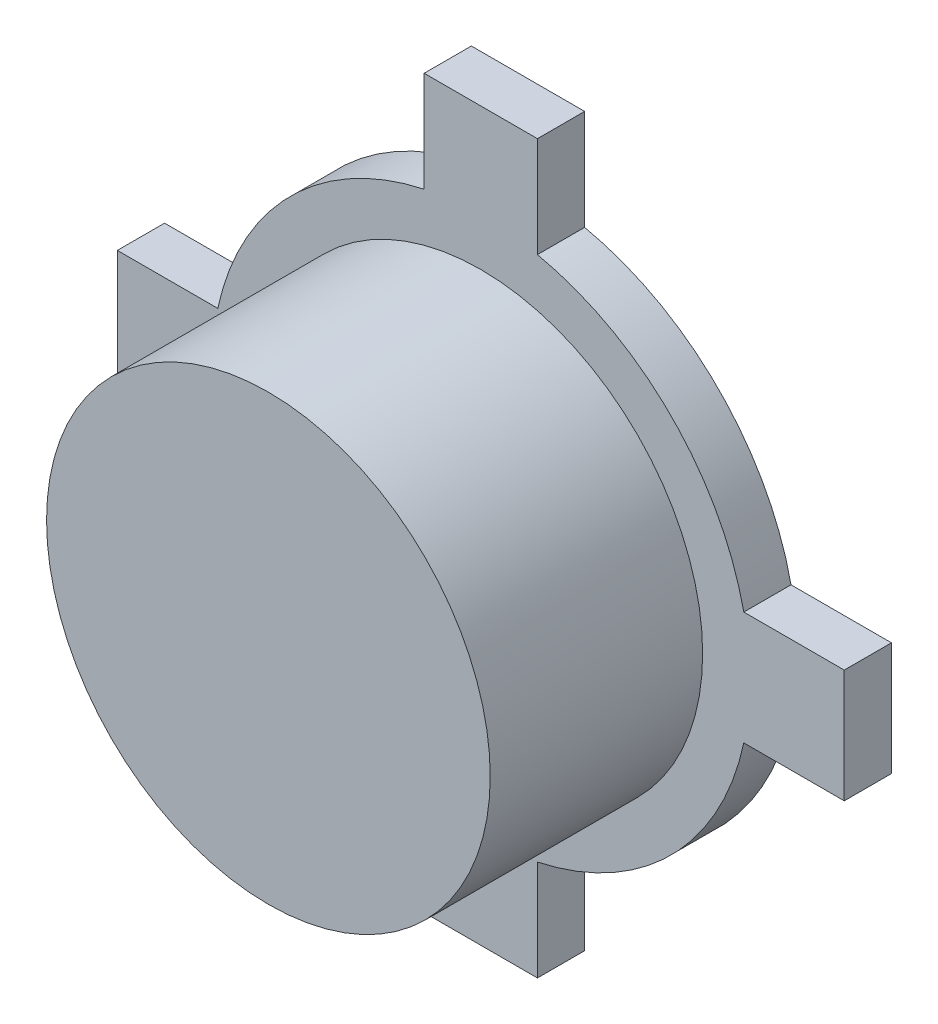
ISO-10303-21;
HEADER;
FILE_DESCRIPTION(('STEP AP214'),'2;1');
FILE_NAME('part.step','',(''),(''),'','','');
FILE_SCHEMA(('AUTOMOTIVE_DESIGN { 1 0 10303 214 1 1 1 1 }'));
ENDSEC;
DATA;
#1=APPLICATION_CONTEXT('core data for automotive mechanical design processes');
#2=APPLICATION_PROTOCOL_DEFINITION('international standard','automotive_design',2000,#1);
#3=PRODUCT_CONTEXT('',#1,'mechanical');
#4=PRODUCT('Part','Part','',(#3));
#5=PRODUCT_RELATED_PRODUCT_CATEGORY('part','',(#4));
#6=PRODUCT_DEFINITION_FORMATION('','',#4);
#7=PRODUCT_DEFINITION_CONTEXT('part definition',#1,'design');
#8=PRODUCT_DEFINITION('design','',#6,#7);
#9=PRODUCT_DEFINITION_SHAPE('','',#8);
#10=(LENGTH_UNIT() NAMED_UNIT(*) SI_UNIT(.MILLI.,.METRE.));
#11=(NAMED_UNIT(*) PLANE_ANGLE_UNIT() SI_UNIT($,.RADIAN.));
#12=(NAMED_UNIT(*) SI_UNIT($,.STERADIAN.) SOLID_ANGLE_UNIT());
#13=UNCERTAINTY_MEASURE_WITH_UNIT(LENGTH_MEASURE(1.E-05),#10,'distance_accuracy_value','');
#14=(GEOMETRIC_REPRESENTATION_CONTEXT(3) GLOBAL_UNCERTAINTY_ASSIGNED_CONTEXT((#13)) GLOBAL_UNIT_ASSIGNED_CONTEXT((#10,
#11,#12)) REPRESENTATION_CONTEXT('',''));
#15=CARTESIAN_POINT('',(0.,0.,0.));
#16=DIRECTION('',(0.,0.,1.));
#17=DIRECTION('',(1.,0.,0.));
#18=AXIS2_PLACEMENT_3D('',#15,#16,#17);
#19=CARTESIAN_POINT('',(0.,0.,4.5));
#20=DIRECTION('',(0.,0.,-1.));
#21=DIRECTION('',(-1.,0.,0.));
#22=AXIS2_PLACEMENT_3D('',#19,#20,#21);
#23=CYLINDRICAL_SURFACE('',#22,4.69999999999996);
#24=CARTESIAN_POINT('',(0.,0.,4.5));
#25=DIRECTION('',(0.,0.,1.));
#26=DIRECTION('',(1.,0.,0.));
#27=AXIS2_PLACEMENT_3D('',#24,#25,#26);
#28=CIRCLE('',#27,4.69999999999996);
#29=CARTESIAN_POINT('',(4.69999999999996,0.,4.5));
#30=VERTEX_POINT('',#29);
#31=EDGE_CURVE('E11',#30,#30,#28,.T.);
#32=ORIENTED_EDGE('',*,*,#31,.F.);
#33=EDGE_LOOP('',(#32));
#34=FACE_BOUND('',#33,.T.);
#35=CARTESIAN_POINT('',(0.,0.,0.));
#36=DIRECTION('',(0.,0.,-1.));
#37=DIRECTION('',(-1.,0.,0.));
#38=AXIS2_PLACEMENT_3D('',#35,#36,#37);
#39=CIRCLE('',#38,4.69999999999996);
#40=CARTESIAN_POINT('',(-4.69999999999996,0.,0.));
#41=VERTEX_POINT('',#40);
#42=EDGE_CURVE('E43',#41,#41,#39,.T.);
#43=ORIENTED_EDGE('',*,*,#42,.F.);
#44=EDGE_LOOP('',(#43));
#45=FACE_BOUND('',#44,.T.);
#46=ADVANCED_FACE('F35',(#34,#45),#23,.T.);
#47=CARTESIAN_POINT('',(0.,0.,4.5));
#48=DIRECTION('',(0.,0.,1.));
#49=DIRECTION('',(1.,0.,0.));
#50=AXIS2_PLACEMENT_3D('',#47,#48,#49);
#51=PLANE('',#50);
#52=ORIENTED_EDGE('',*,*,#31,.T.);
#53=EDGE_LOOP('',(#52));
#54=FACE_BOUND('',#53,.T.);
#55=ADVANCED_FACE('F255',(#54),#51,.T.);
#56=CARTESIAN_POINT('',(0.,0.,-1.));
#57=DIRECTION('',(0.,0.,1.));
#58=DIRECTION('',(1.,0.,0.));
#59=AXIS2_PLACEMENT_3D('',#56,#57,#58);
#60=CYLINDRICAL_SURFACE('',#59,5.69999999999996);
#61=CARTESIAN_POINT('',(0.,0.,0.));
#62=DIRECTION('',(0.,0.,-1.));
#63=DIRECTION('',(-1.,0.,0.));
#64=AXIS2_PLACEMENT_3D('',#61,#62,#63);
#65=CIRCLE('',#64,5.69999999999996);
#66=CARTESIAN_POINT('',(1.19999999999999,5.57225268630198,0.));
#67=VERTEX_POINT('',#66);
#68=CARTESIAN_POINT('',(5.57225268630198,1.19999999999999,0.));
#69=VERTEX_POINT('',#68);
#70=EDGE_CURVE('E180',#67,#69,#65,.T.);
#71=ORIENTED_EDGE('',*,*,#70,.T.);
#72=DIRECTION('',(0.,0.,1.));
#73=VECTOR('',#72,1.);
#74=CARTESIAN_POINT('',(5.57225268630198,1.19999999999999,-1.));
#75=LINE('',#74,#73);
#76=CARTESIAN_POINT('',(5.57225268630198,1.19999999999999,-1.));
#77=VERTEX_POINT('',#76);
#78=EDGE_CURVE('E247',#77,#69,#75,.T.);
#79=ORIENTED_EDGE('',*,*,#78,.F.);
#80=CARTESIAN_POINT('',(0.,0.,-1.));
#81=DIRECTION('',(0.,0.,-1.));
#82=DIRECTION('',(-1.,0.,0.));
#83=AXIS2_PLACEMENT_3D('',#80,#81,#82);
#84=CIRCLE('',#83,5.69999999999996);
#85=CARTESIAN_POINT('',(1.19999999999999,5.57225268630198,-1.));
#86=VERTEX_POINT('',#85);
#87=EDGE_CURVE('E210',#86,#77,#84,.T.);
#88=ORIENTED_EDGE('',*,*,#87,.F.);
#89=DIRECTION('',(0.,0.,1.));
#90=VECTOR('',#89,1.);
#91=CARTESIAN_POINT('',(1.19999999999999,5.57225268630198,-1.));
#92=LINE('',#91,#90);
#93=EDGE_CURVE('E176',#86,#67,#92,.T.);
#94=ORIENTED_EDGE('',*,*,#93,.T.);
#95=EDGE_LOOP('',(#71,#79,#88,#94));
#96=FACE_BOUND('',#95,.T.);
#97=ADVANCED_FACE('F260',(#96),#60,.T.);
#98=CARTESIAN_POINT('',(5.57225268630198,1.19999999999999,-1.));
#99=DIRECTION('',(0.,-1.,0.));
#100=DIRECTION('',(0.,0.,-1.));
#101=AXIS2_PLACEMENT_3D('',#98,#99,#100);
#102=PLANE('',#101);
#103=DIRECTION('',(1.,0.,0.));
#104=VECTOR('',#103,1.);
#105=CARTESIAN_POINT('',(5.57225268630198,1.19999999999999,0.));
#106=LINE('',#105,#104);
#107=CARTESIAN_POINT('',(7.69999999999999,1.19999999999999,0.));
#108=VERTEX_POINT('',#107);
#109=EDGE_CURVE('E183',#69,#108,#106,.T.);
#110=ORIENTED_EDGE('',*,*,#109,.T.);
#111=DIRECTION('',(0.,0.,1.));
#112=VECTOR('',#111,1.);
#113=CARTESIAN_POINT('',(7.69999999999999,1.19999999999999,-1.));
#114=LINE('',#113,#112);
#115=CARTESIAN_POINT('',(7.69999999999999,1.19999999999999,-1.));
#116=VERTEX_POINT('',#115);
#117=EDGE_CURVE('E244',#116,#108,#114,.T.);
#118=ORIENTED_EDGE('',*,*,#117,.F.);
#119=DIRECTION('',(1.,0.,0.));
#120=VECTOR('',#119,1.);
#121=CARTESIAN_POINT('',(5.57225268630198,1.19999999999999,-1.));
#122=LINE('',#121,#120);
#123=EDGE_CURVE('E119',#77,#116,#122,.T.);
#124=ORIENTED_EDGE('',*,*,#123,.F.);
#125=ORIENTED_EDGE('',*,*,#78,.T.);
#126=EDGE_LOOP('',(#110,#118,#124,#125));
#127=FACE_BOUND('',#126,.T.);
#128=ADVANCED_FACE('F266',(#127),#102,.F.);
#129=CARTESIAN_POINT('',(7.69999999999999,1.19999999999999,-1.));
#130=DIRECTION('',(-1.,0.,0.));
#131=DIRECTION('',(0.,0.,1.));
#132=AXIS2_PLACEMENT_3D('',#129,#130,#131);
#133=PLANE('',#132);
#134=DIRECTION('',(0.,-1.,0.));
#135=VECTOR('',#134,1.);
#136=CARTESIAN_POINT('',(7.69999999999999,1.19999999999999,0.));
#137=LINE('',#136,#135);
#138=CARTESIAN_POINT('',(7.69999999999999,-1.19999999999999,0.));
#139=VERTEX_POINT('',#138);
#140=EDGE_CURVE('E185',#108,#139,#137,.T.);
#141=ORIENTED_EDGE('',*,*,#140,.T.);
#142=DIRECTION('',(0.,0.,1.));
#143=VECTOR('',#142,1.);
#144=CARTESIAN_POINT('',(7.69999999999999,-1.19999999999999,-1.));
#145=LINE('',#144,#143);
#146=CARTESIAN_POINT('',(7.69999999999999,-1.19999999999999,-1.));
#147=VERTEX_POINT('',#146);
#148=EDGE_CURVE('E241',#147,#139,#145,.T.);
#149=ORIENTED_EDGE('',*,*,#148,.F.);
#150=DIRECTION('',(0.,-1.,0.));
#151=VECTOR('',#150,1.);
#152=CARTESIAN_POINT('',(7.69999999999999,1.19999999999999,-1.));
#153=LINE('',#152,#151);
#154=EDGE_CURVE('E450',#116,#147,#153,.T.);
#155=ORIENTED_EDGE('',*,*,#154,.F.);
#156=ORIENTED_EDGE('',*,*,#117,.T.);
#157=EDGE_LOOP('',(#141,#149,#155,#156));
#158=FACE_BOUND('',#157,.T.);
#159=ADVANCED_FACE('F272',(#158),#133,.F.);
#160=CARTESIAN_POINT('',(7.69999999999999,-1.19999999999999,-1.));
#161=DIRECTION('',(0.,1.,0.));
#162=DIRECTION('',(0.,0.,1.));
#163=AXIS2_PLACEMENT_3D('',#160,#161,#162);
#164=PLANE('',#163);
#165=DIRECTION('',(-1.,0.,0.));
#166=VECTOR('',#165,1.);
#167=CARTESIAN_POINT('',(7.69999999999999,-1.19999999999999,0.));
#168=LINE('',#167,#166);
#169=CARTESIAN_POINT('',(5.57225268630198,-1.19999999999999,0.));
#170=VERTEX_POINT('',#169);
#171=EDGE_CURVE('E187',#139,#170,#168,.T.);
#172=ORIENTED_EDGE('',*,*,#171,.T.);
#173=DIRECTION('',(0.,0.,1.));
#174=VECTOR('',#173,1.);
#175=CARTESIAN_POINT('',(5.57225268630198,-1.19999999999999,-1.));
#176=LINE('',#175,#174);
#177=CARTESIAN_POINT('',(5.57225268630198,-1.19999999999999,-1.));
#178=VERTEX_POINT('',#177);
#179=EDGE_CURVE('E238',#178,#170,#176,.T.);
#180=ORIENTED_EDGE('',*,*,#179,.F.);
#181=DIRECTION('',(-1.,0.,0.));
#182=VECTOR('',#181,1.);
#183=CARTESIAN_POINT('',(7.69999999999999,-1.19999999999999,-1.));
#184=LINE('',#183,#182);
#185=EDGE_CURVE('E454',#147,#178,#184,.T.);
#186=ORIENTED_EDGE('',*,*,#185,.F.);
#187=ORIENTED_EDGE('',*,*,#148,.T.);
#188=EDGE_LOOP('',(#172,#180,#186,#187));
#189=FACE_BOUND('',#188,.T.);
#190=ADVANCED_FACE('F275',(#189),#164,.F.);
#191=CARTESIAN_POINT('',(0.,0.,-1.));
#192=DIRECTION('',(0.,0.,1.));
#193=DIRECTION('',(1.,0.,0.));
#194=AXIS2_PLACEMENT_3D('',#191,#192,#193);
#195=CYLINDRICAL_SURFACE('',#194,5.69999999999996);
#196=CARTESIAN_POINT('',(0.,0.,0.));
#197=DIRECTION('',(0.,0.,-1.));
#198=DIRECTION('',(-1.,0.,0.));
#199=AXIS2_PLACEMENT_3D('',#196,#197,#198);
#200=CIRCLE('',#199,5.69999999999996);
#201=CARTESIAN_POINT('',(1.2,-5.57225268630198,0.));
#202=VERTEX_POINT('',#201);
#203=EDGE_CURVE('E189',#170,#202,#200,.T.);
#204=ORIENTED_EDGE('',*,*,#203,.T.);
#205=DIRECTION('',(0.,0.,1.));
#206=VECTOR('',#205,1.);
#207=CARTESIAN_POINT('',(1.2,-5.57225268630198,-1.));
#208=LINE('',#207,#206);
#209=CARTESIAN_POINT('',(1.2,-5.57225268630198,-1.));
#210=VERTEX_POINT('',#209);
#211=EDGE_CURVE('E235',#210,#202,#208,.T.);
#212=ORIENTED_EDGE('',*,*,#211,.F.);
#213=CARTESIAN_POINT('',(0.,0.,-1.));
#214=DIRECTION('',(0.,0.,-1.));
#215=DIRECTION('',(-1.,0.,0.));
#216=AXIS2_PLACEMENT_3D('',#213,#214,#215);
#217=CIRCLE('',#216,5.69999999999996);
#218=EDGE_CURVE('E456',#178,#210,#217,.T.);
#219=ORIENTED_EDGE('',*,*,#218,.F.);
#220=ORIENTED_EDGE('',*,*,#179,.T.);
#221=EDGE_LOOP('',(#204,#212,#219,#220));
#222=FACE_BOUND('',#221,.T.);
#223=ADVANCED_FACE('F279',(#222),#195,.T.);
#224=CARTESIAN_POINT('',(1.2,-5.57225268630198,-1.));
#225=DIRECTION('',(-1.,0.,0.));
#226=DIRECTION('',(0.,-1.,0.));
#227=AXIS2_PLACEMENT_3D('',#224,#225,#226);
#228=PLANE('',#227);
#229=DIRECTION('',(0.,-1.,0.));
#230=VECTOR('',#229,1.);
#231=CARTESIAN_POINT('',(1.2,-5.57225268630198,0.));
#232=LINE('',#231,#230);
#233=CARTESIAN_POINT('',(1.2,-7.69999999999999,0.));
#234=VERTEX_POINT('',#233);
#235=EDGE_CURVE('E191',#202,#234,#232,.T.);
#236=ORIENTED_EDGE('',*,*,#235,.T.);
#237=DIRECTION('',(0.,0.,1.));
#238=VECTOR('',#237,1.);
#239=CARTESIAN_POINT('',(1.2,-7.69999999999999,-1.));
#240=LINE('',#239,#238);
#241=CARTESIAN_POINT('',(1.2,-7.69999999999999,-1.));
#242=VERTEX_POINT('',#241);
#243=EDGE_CURVE('E232',#242,#234,#240,.T.);
#244=ORIENTED_EDGE('',*,*,#243,.F.);
#245=DIRECTION('',(0.,-1.,0.));
#246=VECTOR('',#245,1.);
#247=CARTESIAN_POINT('',(1.2,-5.57225268630198,-1.));
#248=LINE('',#247,#246);
#249=EDGE_CURVE('E458',#210,#242,#248,.T.);
#250=ORIENTED_EDGE('',*,*,#249,.F.);
#251=ORIENTED_EDGE('',*,*,#211,.T.);
#252=EDGE_LOOP('',(#236,#244,#250,#251));
#253=FACE_BOUND('',#252,.T.);
#254=ADVANCED_FACE('F283',(#253),#228,.F.);
#255=CARTESIAN_POINT('',(1.2,-7.69999999999999,-1.));
#256=DIRECTION('',(0.,1.,0.));
#257=DIRECTION('',(0.,0.,1.));
#258=AXIS2_PLACEMENT_3D('',#255,#256,#257);
#259=PLANE('',#258);
#260=DIRECTION('',(-1.,0.,0.));
#261=VECTOR('',#260,1.);
#262=CARTESIAN_POINT('',(1.2,-7.69999999999999,0.));
#263=LINE('',#262,#261);
#264=CARTESIAN_POINT('',(-1.2,-7.69999999999999,0.));
#265=VERTEX_POINT('',#264);
#266=EDGE_CURVE('E193',#234,#265,#263,.T.);
#267=ORIENTED_EDGE('',*,*,#266,.T.);
#268=DIRECTION('',(0.,0.,1.));
#269=VECTOR('',#268,1.);
#270=CARTESIAN_POINT('',(-1.2,-7.69999999999999,-1.));
#271=LINE('',#270,#269);
#272=CARTESIAN_POINT('',(-1.2,-7.69999999999999,-1.));
#273=VERTEX_POINT('',#272);
#274=EDGE_CURVE('E229',#273,#265,#271,.T.);
#275=ORIENTED_EDGE('',*,*,#274,.F.);
#276=DIRECTION('',(-1.,0.,0.));
#277=VECTOR('',#276,1.);
#278=CARTESIAN_POINT('',(1.2,-7.69999999999999,-1.));
#279=LINE('',#278,#277);
#280=EDGE_CURVE('E460',#242,#273,#279,.T.);
#281=ORIENTED_EDGE('',*,*,#280,.F.);
#282=ORIENTED_EDGE('',*,*,#243,.T.);
#283=EDGE_LOOP('',(#267,#275,#281,#282));
#284=FACE_BOUND('',#283,.T.);
#285=ADVANCED_FACE('F287',(#284),#259,.F.);
#286=CARTESIAN_POINT('',(-1.2,-7.69999999999999,-1.));
#287=DIRECTION('',(1.,0.,0.));
#288=DIRECTION('',(0.,1.,0.));
#289=AXIS2_PLACEMENT_3D('',#286,#287,#288);
#290=PLANE('',#289);
#291=DIRECTION('',(0.,1.,0.));
#292=VECTOR('',#291,1.);
#293=CARTESIAN_POINT('',(-1.2,-7.69999999999999,0.));
#294=LINE('',#293,#292);
#295=CARTESIAN_POINT('',(-1.20000000000001,-5.57225268630198,0.));
#296=VERTEX_POINT('',#295);
#297=EDGE_CURVE('E195',#265,#296,#294,.T.);
#298=ORIENTED_EDGE('',*,*,#297,.T.);
#299=DIRECTION('',(0.,0.,1.));
#300=VECTOR('',#299,1.);
#301=CARTESIAN_POINT('',(-1.20000000000001,-5.57225268630198,-1.));
#302=LINE('',#301,#300);
#303=CARTESIAN_POINT('',(-1.20000000000001,-5.57225268630198,-1.));
#304=VERTEX_POINT('',#303);
#305=EDGE_CURVE('E226',#304,#296,#302,.T.);
#306=ORIENTED_EDGE('',*,*,#305,.F.);
#307=DIRECTION('',(0.,1.,0.));
#308=VECTOR('',#307,1.);
#309=CARTESIAN_POINT('',(-1.2,-7.69999999999999,-1.));
#310=LINE('',#309,#308);
#311=EDGE_CURVE('E462',#273,#304,#310,.T.);
#312=ORIENTED_EDGE('',*,*,#311,.F.);
#313=ORIENTED_EDGE('',*,*,#274,.T.);
#314=EDGE_LOOP('',(#298,#306,#312,#313));
#315=FACE_BOUND('',#314,.T.);
#316=ADVANCED_FACE('F291',(#315),#290,.F.);
#317=CARTESIAN_POINT('',(0.,0.,-1.));
#318=DIRECTION('',(0.,0.,1.));
#319=DIRECTION('',(1.,0.,0.));
#320=AXIS2_PLACEMENT_3D('',#317,#318,#319);
#321=CYLINDRICAL_SURFACE('',#320,5.69999999999996);
#322=CARTESIAN_POINT('',(0.,0.,0.));
#323=DIRECTION('',(0.,0.,-1.));
#324=DIRECTION('',(-1.,0.,0.));
#325=AXIS2_PLACEMENT_3D('',#322,#323,#324);
#326=CIRCLE('',#325,5.69999999999996);
#327=CARTESIAN_POINT('',(-5.57225268630198,-1.2,0.));
#328=VERTEX_POINT('',#327);
#329=EDGE_CURVE('E197',#296,#328,#326,.T.);
#330=ORIENTED_EDGE('',*,*,#329,.T.);
#331=DIRECTION('',(0.,0.,1.));
#332=VECTOR('',#331,1.);
#333=CARTESIAN_POINT('',(-5.57225268630198,-1.2,-1.));
#334=LINE('',#333,#332);
#335=CARTESIAN_POINT('',(-5.57225268630198,-1.2,-1.));
#336=VERTEX_POINT('',#335);
#337=EDGE_CURVE('E223',#336,#328,#334,.T.);
#338=ORIENTED_EDGE('',*,*,#337,.F.);
#339=CARTESIAN_POINT('',(0.,0.,-1.));
#340=DIRECTION('',(0.,0.,-1.));
#341=DIRECTION('',(-1.,0.,0.));
#342=AXIS2_PLACEMENT_3D('',#339,#340,#341);
#343=CIRCLE('',#342,5.69999999999996);
#344=EDGE_CURVE('E464',#304,#336,#343,.T.);
#345=ORIENTED_EDGE('',*,*,#344,.F.);
#346=ORIENTED_EDGE('',*,*,#305,.T.);
#347=EDGE_LOOP('',(#330,#338,#345,#346));
#348=FACE_BOUND('',#347,.T.);
#349=ADVANCED_FACE('F295',(#348),#321,.T.);
#350=CARTESIAN_POINT('',(-5.57225268630198,-1.19999999999999,-1.));
#351=DIRECTION('',(0.,1.,0.));
#352=DIRECTION('',(0.,0.,1.));
#353=AXIS2_PLACEMENT_3D('',#350,#351,#352);
#354=PLANE('',#353);
#355=DIRECTION('',(-1.,0.,0.));
#356=VECTOR('',#355,1.);
#357=CARTESIAN_POINT('',(-5.57225268630198,-1.19999999999999,0.));
#358=LINE('',#357,#356);
#359=CARTESIAN_POINT('',(-7.69999999999998,-1.19999999999999,0.));
#360=VERTEX_POINT('',#359);
#361=EDGE_CURVE('E199',#328,#360,#358,.T.);
#362=ORIENTED_EDGE('',*,*,#361,.T.);
#363=DIRECTION('',(0.,0.,1.));
#364=VECTOR('',#363,1.);
#365=CARTESIAN_POINT('',(-7.69999999999998,-1.19999999999999,-1.));
#366=LINE('',#365,#364);
#367=CARTESIAN_POINT('',(-7.69999999999998,-1.19999999999999,-1.));
#368=VERTEX_POINT('',#367);
#369=EDGE_CURVE('E220',#368,#360,#366,.T.);
#370=ORIENTED_EDGE('',*,*,#369,.F.);
#371=DIRECTION('',(-1.,0.,0.));
#372=VECTOR('',#371,1.);
#373=CARTESIAN_POINT('',(-5.57225268630198,-1.19999999999999,-1.));
#374=LINE('',#373,#372);
#375=EDGE_CURVE('E466',#336,#368,#374,.T.);
#376=ORIENTED_EDGE('',*,*,#375,.F.);
#377=ORIENTED_EDGE('',*,*,#337,.T.);
#378=EDGE_LOOP('',(#362,#370,#376,#377));
#379=FACE_BOUND('',#378,.T.);
#380=ADVANCED_FACE('F299',(#379),#354,.F.);
#381=CARTESIAN_POINT('',(-7.69999999999998,-1.19999999999999,-1.));
#382=DIRECTION('',(1.,0.,0.));
#383=DIRECTION('',(0.,0.,-1.));
#384=AXIS2_PLACEMENT_3D('',#381,#382,#383);
#385=PLANE('',#384);
#386=DIRECTION('',(0.,1.,0.));
#387=VECTOR('',#386,1.);
#388=CARTESIAN_POINT('',(-7.69999999999998,-1.19999999999999,0.));
#389=LINE('',#388,#387);
#390=CARTESIAN_POINT('',(-7.69999999999998,1.19999999999999,0.));
#391=VERTEX_POINT('',#390);
#392=EDGE_CURVE('E201',#360,#391,#389,.T.);
#393=ORIENTED_EDGE('',*,*,#392,.T.);
#394=DIRECTION('',(0.,0.,1.));
#395=VECTOR('',#394,1.);
#396=CARTESIAN_POINT('',(-7.69999999999998,1.19999999999999,-1.));
#397=LINE('',#396,#395);
#398=CARTESIAN_POINT('',(-7.69999999999998,1.19999999999999,-1.));
#399=VERTEX_POINT('',#398);
#400=EDGE_CURVE('E217',#399,#391,#397,.T.);
#401=ORIENTED_EDGE('',*,*,#400,.F.);
#402=DIRECTION('',(0.,1.,0.));
#403=VECTOR('',#402,1.);
#404=CARTESIAN_POINT('',(-7.69999999999998,-1.19999999999999,-1.));
#405=LINE('',#404,#403);
#406=EDGE_CURVE('E468',#368,#399,#405,.T.);
#407=ORIENTED_EDGE('',*,*,#406,.F.);
#408=ORIENTED_EDGE('',*,*,#369,.T.);
#409=EDGE_LOOP('',(#393,#401,#407,#408));
#410=FACE_BOUND('',#409,.T.);
#411=ADVANCED_FACE('F303',(#410),#385,.F.);
#412=CARTESIAN_POINT('',(-7.69999999999998,1.19999999999999,-1.));
#413=DIRECTION('',(0.,-1.,0.));
#414=DIRECTION('',(0.,0.,-1.));
#415=AXIS2_PLACEMENT_3D('',#412,#413,#414);
#416=PLANE('',#415);
#417=DIRECTION('',(1.,0.,0.));
#418=VECTOR('',#417,1.);
#419=CARTESIAN_POINT('',(-7.69999999999998,1.19999999999999,0.));
#420=LINE('',#419,#418);
#421=CARTESIAN_POINT('',(-5.57225268630198,1.19999999999999,0.));
#422=VERTEX_POINT('',#421);
#423=EDGE_CURVE('E203',#391,#422,#420,.T.);
#424=ORIENTED_EDGE('',*,*,#423,.T.);
#425=DIRECTION('',(0.,0.,1.));
#426=VECTOR('',#425,1.);
#427=CARTESIAN_POINT('',(-5.57225268630198,1.19999999999999,-1.));
#428=LINE('',#427,#426);
#429=CARTESIAN_POINT('',(-5.57225268630198,1.19999999999999,-1.));
#430=VERTEX_POINT('',#429);
#431=EDGE_CURVE('E214',#430,#422,#428,.T.);
#432=ORIENTED_EDGE('',*,*,#431,.F.);
#433=DIRECTION('',(1.,0.,0.));
#434=VECTOR('',#433,1.);
#435=CARTESIAN_POINT('',(-7.69999999999998,1.19999999999999,-1.));
#436=LINE('',#435,#434);
#437=EDGE_CURVE('E470',#399,#430,#436,.T.);
#438=ORIENTED_EDGE('',*,*,#437,.F.);
#439=ORIENTED_EDGE('',*,*,#400,.T.);
#440=EDGE_LOOP('',(#424,#432,#438,#439));
#441=FACE_BOUND('',#440,.T.);
#442=ADVANCED_FACE('F307',(#441),#416,.F.);
#443=CARTESIAN_POINT('',(0.,0.,-1.));
#444=DIRECTION('',(0.,0.,1.));
#445=DIRECTION('',(1.,0.,0.));
#446=AXIS2_PLACEMENT_3D('',#443,#444,#445);
#447=CYLINDRICAL_SURFACE('',#446,5.69999999999996);
#448=CARTESIAN_POINT('',(0.,0.,0.));
#449=DIRECTION('',(0.,0.,-1.));
#450=DIRECTION('',(-1.,0.,0.));
#451=AXIS2_PLACEMENT_3D('',#448,#449,#450);
#452=CIRCLE('',#451,5.69999999999996);
#453=CARTESIAN_POINT('',(-1.20000000000001,5.57225268630198,0.));
#454=VERTEX_POINT('',#453);
#455=EDGE_CURVE('E205',#422,#454,#452,.T.);
#456=ORIENTED_EDGE('',*,*,#455,.T.);
#457=DIRECTION('',(0.,0.,1.));
#458=VECTOR('',#457,1.);
#459=CARTESIAN_POINT('',(-1.20000000000001,5.57225268630198,-1.));
#460=LINE('',#459,#458);
#461=CARTESIAN_POINT('',(-1.20000000000001,5.57225268630198,-1.));
#462=VERTEX_POINT('',#461);
#463=EDGE_CURVE('E171',#462,#454,#460,.T.);
#464=ORIENTED_EDGE('',*,*,#463,.F.);
#465=CARTESIAN_POINT('',(0.,0.,-1.));
#466=DIRECTION('',(0.,0.,-1.));
#467=DIRECTION('',(-1.,0.,0.));
#468=AXIS2_PLACEMENT_3D('',#465,#466,#467);
#469=CIRCLE('',#468,5.69999999999996);
#470=EDGE_CURVE('E162',#430,#462,#469,.T.);
#471=ORIENTED_EDGE('',*,*,#470,.F.);
#472=ORIENTED_EDGE('',*,*,#431,.T.);
#473=EDGE_LOOP('',(#456,#464,#471,#472));
#474=FACE_BOUND('',#473,.T.);
#475=ADVANCED_FACE('F311',(#474),#447,.T.);
#476=CARTESIAN_POINT('',(-1.20000000000001,5.57225268630197,-1.));
#477=DIRECTION('',(1.,0.,0.));
#478=DIRECTION('',(0.,1.,0.));
#479=AXIS2_PLACEMENT_3D('',#476,#477,#478);
#480=PLANE('',#479);
#481=DIRECTION('',(0.,1.,0.));
#482=VECTOR('',#481,1.);
#483=CARTESIAN_POINT('',(-1.20000000000001,5.57225268630197,0.));
#484=LINE('',#483,#482);
#485=CARTESIAN_POINT('',(-1.2,7.69999999999998,0.));
#486=VERTEX_POINT('',#485);
#487=EDGE_CURVE('E170',#454,#486,#484,.T.);
#488=ORIENTED_EDGE('',*,*,#487,.T.);
#489=DIRECTION('',(0.,0.,1.));
#490=VECTOR('',#489,1.);
#491=CARTESIAN_POINT('',(-1.2,7.69999999999998,-1.));
#492=LINE('',#491,#490);
#493=CARTESIAN_POINT('',(-1.2,7.69999999999998,-1.));
#494=VERTEX_POINT('',#493);
#495=EDGE_CURVE('E167',#494,#486,#492,.T.);
#496=ORIENTED_EDGE('',*,*,#495,.F.);
#497=DIRECTION('',(0.,1.,0.));
#498=VECTOR('',#497,1.);
#499=CARTESIAN_POINT('',(-1.20000000000001,5.57225268630197,-1.));
#500=LINE('',#499,#498);
#501=EDGE_CURVE('E156',#462,#494,#500,.T.);
#502=ORIENTED_EDGE('',*,*,#501,.F.);
#503=ORIENTED_EDGE('',*,*,#463,.T.);
#504=EDGE_LOOP('',(#488,#496,#502,#503));
#505=FACE_BOUND('',#504,.T.);
#506=ADVANCED_FACE('F168',(#505),#480,.F.);
#507=CARTESIAN_POINT('',(-1.2,7.69999999999998,-1.));
#508=DIRECTION('',(0.,-1.,0.));
#509=DIRECTION('',(0.,0.,-1.));
#510=AXIS2_PLACEMENT_3D('',#507,#508,#509);
#511=PLANE('',#510);
#512=DIRECTION('',(1.,0.,0.));
#513=VECTOR('',#512,1.);
#514=CARTESIAN_POINT('',(-1.2,7.69999999999998,0.));
#515=LINE('',#514,#513);
#516=CARTESIAN_POINT('',(1.19999999999999,7.69999999999998,0.));
#517=VERTEX_POINT('',#516);
#518=EDGE_CURVE('E104',#486,#517,#515,.T.);
#519=ORIENTED_EDGE('',*,*,#518,.T.);
#520=DIRECTION('',(0.,0.,1.));
#521=VECTOR('',#520,1.);
#522=CARTESIAN_POINT('',(1.19999999999999,7.69999999999998,-1.));
#523=LINE('',#522,#521);
#524=CARTESIAN_POINT('',(1.19999999999999,7.69999999999998,-1.));
#525=VERTEX_POINT('',#524);
#526=EDGE_CURVE('E172',#525,#517,#523,.T.);
#527=ORIENTED_EDGE('',*,*,#526,.F.);
#528=DIRECTION('',(1.,0.,0.));
#529=VECTOR('',#528,1.);
#530=CARTESIAN_POINT('',(-1.2,7.69999999999998,-1.));
#531=LINE('',#530,#529);
#532=EDGE_CURVE('E160',#494,#525,#531,.T.);
#533=ORIENTED_EDGE('',*,*,#532,.F.);
#534=ORIENTED_EDGE('',*,*,#495,.T.);
#535=EDGE_LOOP('',(#519,#527,#533,#534));
#536=FACE_BOUND('',#535,.T.);
#537=ADVANCED_FACE('F174',(#536),#511,.F.);
#538=CARTESIAN_POINT('',(1.19999999999999,7.69999999999998,-1.));
#539=DIRECTION('',(-1.,0.,0.));
#540=DIRECTION('',(0.,0.,1.));
#541=AXIS2_PLACEMENT_3D('',#538,#539,#540);
#542=PLANE('',#541);
#543=DIRECTION('',(0.,-1.,0.));
#544=VECTOR('',#543,1.);
#545=CARTESIAN_POINT('',(1.19999999999999,7.69999999999998,0.));
#546=LINE('',#545,#544);
#547=EDGE_CURVE('E110',#517,#67,#546,.T.);
#548=ORIENTED_EDGE('',*,*,#547,.T.);
#549=ORIENTED_EDGE('',*,*,#93,.F.);
#550=DIRECTION('',(0.,-1.,0.));
#551=VECTOR('',#550,1.);
#552=CARTESIAN_POINT('',(1.19999999999999,7.69999999999998,-1.));
#553=LINE('',#552,#551);
#554=EDGE_CURVE('E51',#525,#86,#553,.T.);
#555=ORIENTED_EDGE('',*,*,#554,.F.);
#556=ORIENTED_EDGE('',*,*,#526,.T.);
#557=EDGE_LOOP('',(#548,#549,#555,#556));
#558=FACE_BOUND('',#557,.T.);
#559=ADVANCED_FACE('F320',(#558),#542,.F.);
#560=CARTESIAN_POINT('',(0.,0.,-1.));
#561=DIRECTION('',(0.,0.,-1.));
#562=DIRECTION('',(-1.,0.,0.));
#563=AXIS2_PLACEMENT_3D('',#560,#561,#562);
#564=PLANE('',#563);
#565=ORIENTED_EDGE('',*,*,#87,.T.);
#566=ORIENTED_EDGE('',*,*,#123,.T.);
#567=ORIENTED_EDGE('',*,*,#154,.T.);
#568=ORIENTED_EDGE('',*,*,#185,.T.);
#569=ORIENTED_EDGE('',*,*,#218,.T.);
#570=ORIENTED_EDGE('',*,*,#249,.T.);
#571=ORIENTED_EDGE('',*,*,#280,.T.);
#572=ORIENTED_EDGE('',*,*,#311,.T.);
#573=ORIENTED_EDGE('',*,*,#344,.T.);
#574=ORIENTED_EDGE('',*,*,#375,.T.);
#575=ORIENTED_EDGE('',*,*,#406,.T.);
#576=ORIENTED_EDGE('',*,*,#437,.T.);
#577=ORIENTED_EDGE('',*,*,#470,.T.);
#578=ORIENTED_EDGE('',*,*,#501,.T.);
#579=ORIENTED_EDGE('',*,*,#532,.T.);
#580=ORIENTED_EDGE('',*,*,#554,.T.);
#581=EDGE_LOOP('',(#565,#566,#567,#568,#569,#570,#571,#572,#573,#574,#575,#576,#577,#578,#579,#580));
#582=FACE_BOUND('',#581,.T.);
#583=ADVANCED_FACE('F158',(#582),#564,.T.);
#584=CARTESIAN_POINT('',(0.,0.,0.));
#585=DIRECTION('',(0.,0.,-1.));
#586=DIRECTION('',(-1.,0.,0.));
#587=AXIS2_PLACEMENT_3D('',#584,#585,#586);
#588=PLANE('',#587);
#589=ORIENTED_EDGE('',*,*,#42,.T.);
#590=EDGE_LOOP('',(#589));
#591=FACE_BOUND('',#590,.T.);
#592=ORIENTED_EDGE('',*,*,#70,.F.);
#593=ORIENTED_EDGE('',*,*,#547,.F.);
#594=ORIENTED_EDGE('',*,*,#518,.F.);
#595=ORIENTED_EDGE('',*,*,#487,.F.);
#596=ORIENTED_EDGE('',*,*,#455,.F.);
#597=ORIENTED_EDGE('',*,*,#423,.F.);
#598=ORIENTED_EDGE('',*,*,#392,.F.);
#599=ORIENTED_EDGE('',*,*,#361,.F.);
#600=ORIENTED_EDGE('',*,*,#329,.F.);
#601=ORIENTED_EDGE('',*,*,#297,.F.);
#602=ORIENTED_EDGE('',*,*,#266,.F.);
#603=ORIENTED_EDGE('',*,*,#235,.F.);
#604=ORIENTED_EDGE('',*,*,#203,.F.);
#605=ORIENTED_EDGE('',*,*,#171,.F.);
#606=ORIENTED_EDGE('',*,*,#140,.F.);
#607=ORIENTED_EDGE('',*,*,#109,.F.);
#608=EDGE_LOOP('',(#592,#593,#594,#595,#596,#597,#598,#599,#600,#601,#602,#603,#604,#605,#606,#607));
#609=FACE_BOUND('',#608,.T.);
#610=ADVANCED_FACE('F251',(#591,#609),#588,.F.);
#611=CLOSED_SHELL('',(#46,#55,#97,#128,#159,#190,#223,#254,#285,#316,#349,#380,#411,#442,#475,
#506,#537,#559,#583,#610));
#612=MANIFOLD_SOLID_BREP('B2',#611);
#613=ADVANCED_BREP_SHAPE_REPRESENTATION('',(#18,#612),#14);
#614=SHAPE_DEFINITION_REPRESENTATION(#9,#613);
ENDSEC;
END-ISO-10303-21;
